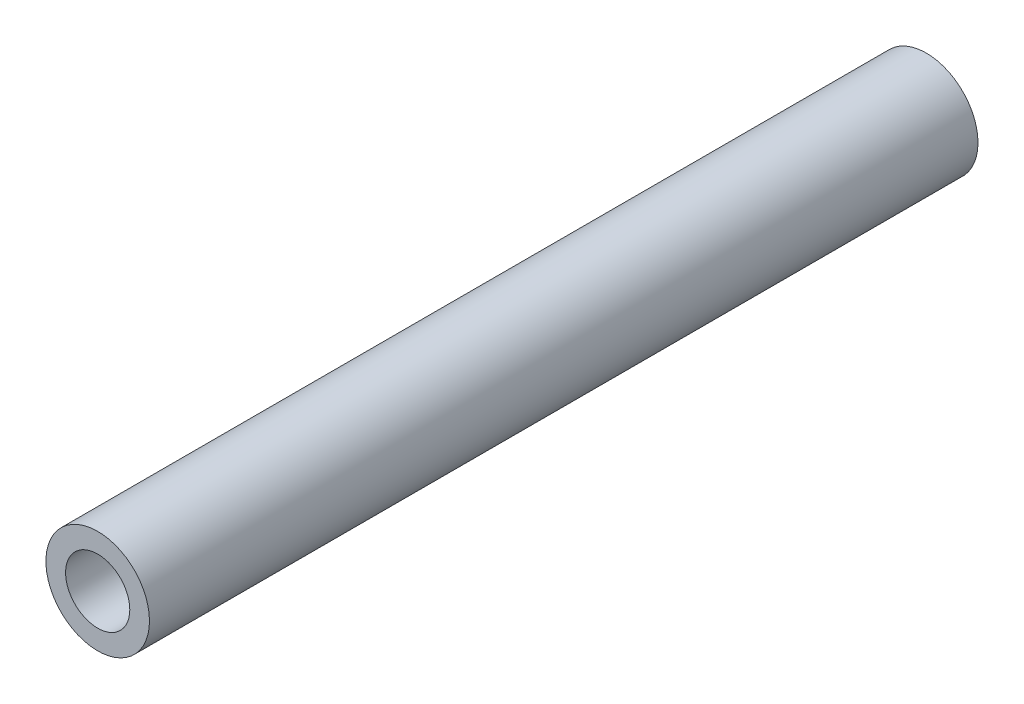
ISO-10303-21;
HEADER;
FILE_DESCRIPTION(('STEP AP214'),'2;1');
FILE_NAME('part.step','',(''),(''),'','','');
FILE_SCHEMA(('AUTOMOTIVE_DESIGN { 1 0 10303 214 1 1 1 1 }'));
ENDSEC;
DATA;
#1=APPLICATION_CONTEXT('core data for automotive mechanical design processes');
#2=APPLICATION_PROTOCOL_DEFINITION('international standard','automotive_design',2000,#1);
#3=PRODUCT_CONTEXT('',#1,'mechanical');
#4=PRODUCT('Part','Part','',(#3));
#5=PRODUCT_RELATED_PRODUCT_CATEGORY('part','',(#4));
#6=PRODUCT_DEFINITION_FORMATION('','',#4);
#7=PRODUCT_DEFINITION_CONTEXT('part definition',#1,'design');
#8=PRODUCT_DEFINITION('design','',#6,#7);
#9=PRODUCT_DEFINITION_SHAPE('','',#8);
#10=(LENGTH_UNIT() NAMED_UNIT(*) SI_UNIT(.MILLI.,.METRE.));
#11=(NAMED_UNIT(*) PLANE_ANGLE_UNIT() SI_UNIT($,.RADIAN.));
#12=(NAMED_UNIT(*) SI_UNIT($,.STERADIAN.) SOLID_ANGLE_UNIT());
#13=UNCERTAINTY_MEASURE_WITH_UNIT(LENGTH_MEASURE(1.E-05),#10,'distance_accuracy_value','');
#14=(GEOMETRIC_REPRESENTATION_CONTEXT(3) GLOBAL_UNCERTAINTY_ASSIGNED_CONTEXT((#13)) GLOBAL_UNIT_ASSIGNED_CONTEXT((#10,
#11,#12)) REPRESENTATION_CONTEXT('',''));
#15=CARTESIAN_POINT('',(0.,0.,0.));
#16=DIRECTION('',(0.,0.,1.));
#17=DIRECTION('',(1.,0.,0.));
#18=AXIS2_PLACEMENT_3D('',#15,#16,#17);
#19=CARTESIAN_POINT('',(0.,0.,40.));
#20=DIRECTION('',(0.,0.,1.));
#21=DIRECTION('',(1.,0.,0.));
#22=AXIS2_PLACEMENT_3D('',#19,#20,#21);
#23=PLANE('',#22);
#24=CARTESIAN_POINT('',(0.,0.,40.));
#25=DIRECTION('',(0.,0.,1.));
#26=DIRECTION('',(1.,0.,0.));
#27=AXIS2_PLACEMENT_3D('',#24,#25,#26);
#28=CIRCLE('',#27,2.5);
#29=CARTESIAN_POINT('',(2.5,0.,40.));
#30=VERTEX_POINT('',#29);
#31=EDGE_CURVE('E10',#30,#30,#28,.T.);
#32=ORIENTED_EDGE('',*,*,#31,.T.);
#33=EDGE_LOOP('',(#32));
#34=FACE_BOUND('',#33,.T.);
#35=CARTESIAN_POINT('',(0.,0.,40.));
#36=DIRECTION('',(0.,0.,1.));
#37=DIRECTION('',(1.,0.,0.));
#38=AXIS2_PLACEMENT_3D('',#35,#36,#37);
#39=CIRCLE('',#38,1.55);
#40=CARTESIAN_POINT('',(1.55,0.,40.));
#41=VERTEX_POINT('',#40);
#42=EDGE_CURVE('E45',#41,#41,#39,.T.);
#43=ORIENTED_EDGE('',*,*,#42,.F.);
#44=EDGE_LOOP('',(#43));
#45=FACE_BOUND('',#44,.T.);
#46=ADVANCED_FACE('F34',(#34,#45),#23,.T.);
#47=CARTESIAN_POINT('',(0.,0.,0.));
#48=DIRECTION('',(0.,0.,1.));
#49=DIRECTION('',(1.,0.,0.));
#50=AXIS2_PLACEMENT_3D('',#47,#48,#49);
#51=PLANE('',#50);
#52=CARTESIAN_POINT('',(0.,0.,0.));
#53=DIRECTION('',(0.,0.,1.));
#54=DIRECTION('',(1.,0.,0.));
#55=AXIS2_PLACEMENT_3D('',#52,#53,#54);
#56=CIRCLE('',#55,2.5);
#57=CARTESIAN_POINT('',(2.5,0.,0.));
#58=VERTEX_POINT('',#57);
#59=EDGE_CURVE('E38',#58,#58,#56,.T.);
#60=ORIENTED_EDGE('',*,*,#59,.F.);
#61=EDGE_LOOP('',(#60));
#62=FACE_BOUND('',#61,.T.);
#63=CARTESIAN_POINT('',(0.,0.,0.));
#64=DIRECTION('',(0.,0.,1.));
#65=DIRECTION('',(1.,0.,0.));
#66=AXIS2_PLACEMENT_3D('',#63,#64,#65);
#67=CIRCLE('',#66,1.55);
#68=CARTESIAN_POINT('',(1.55,0.,0.));
#69=VERTEX_POINT('',#68);
#70=EDGE_CURVE('E47',#69,#69,#67,.T.);
#71=ORIENTED_EDGE('',*,*,#70,.T.);
#72=EDGE_LOOP('',(#71));
#73=FACE_BOUND('',#72,.T.);
#74=ADVANCED_FACE('F57',(#62,#73),#51,.F.);
#75=CARTESIAN_POINT('',(0.,0.,40.));
#76=DIRECTION('',(0.,0.,-1.));
#77=DIRECTION('',(-1.,0.,0.));
#78=AXIS2_PLACEMENT_3D('',#75,#76,#77);
#79=CYLINDRICAL_SURFACE('',#78,2.5);
#80=ORIENTED_EDGE('',*,*,#31,.F.);
#81=EDGE_LOOP('',(#80));
#82=FACE_BOUND('',#81,.T.);
#83=ORIENTED_EDGE('',*,*,#59,.T.);
#84=EDGE_LOOP('',(#83));
#85=FACE_BOUND('',#84,.T.);
#86=ADVANCED_FACE('F36',(#82,#85),#79,.T.);
#87=CARTESIAN_POINT('',(0.,0.,40.));
#88=DIRECTION('',(0.,0.,-1.));
#89=DIRECTION('',(-1.,0.,0.));
#90=AXIS2_PLACEMENT_3D('',#87,#88,#89);
#91=CYLINDRICAL_SURFACE('',#90,1.55);
#92=ORIENTED_EDGE('',*,*,#42,.T.);
#93=EDGE_LOOP('',(#92));
#94=FACE_BOUND('',#93,.T.);
#95=ORIENTED_EDGE('',*,*,#70,.F.);
#96=EDGE_LOOP('',(#95));
#97=FACE_BOUND('',#96,.T.);
#98=ADVANCED_FACE('F53',(#94,#97),#91,.F.);
#99=CLOSED_SHELL('',(#46,#74,#86,#98));
#100=MANIFOLD_SOLID_BREP('B2',#99);
#101=ADVANCED_BREP_SHAPE_REPRESENTATION('',(#18,#100),#14);
#102=SHAPE_DEFINITION_REPRESENTATION(#9,#101);
ENDSEC;
END-ISO-10303-21;
